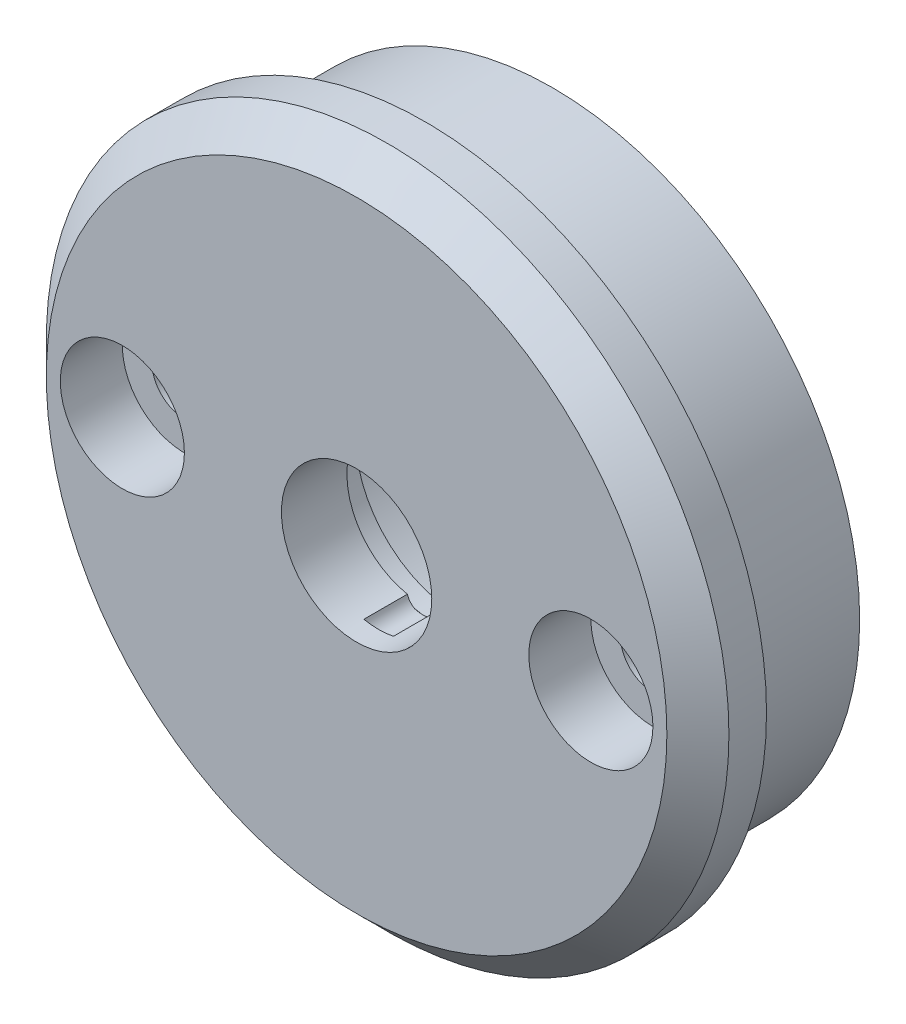
ISO-10303-21;
HEADER;
FILE_DESCRIPTION(('STEP AP214'),'2;1');
FILE_NAME('part.step','',(''),(''),'','','');
FILE_SCHEMA(('AUTOMOTIVE_DESIGN { 1 0 10303 214 1 1 1 1 }'));
ENDSEC;
DATA;
#1=APPLICATION_CONTEXT('core data for automotive mechanical design processes');
#2=APPLICATION_PROTOCOL_DEFINITION('international standard','automotive_design',2000,#1);
#3=PRODUCT_CONTEXT('',#1,'mechanical');
#4=PRODUCT('Part','Part','',(#3));
#5=PRODUCT_RELATED_PRODUCT_CATEGORY('part','',(#4));
#6=PRODUCT_DEFINITION_FORMATION('','',#4);
#7=PRODUCT_DEFINITION_CONTEXT('part definition',#1,'design');
#8=PRODUCT_DEFINITION('design','',#6,#7);
#9=PRODUCT_DEFINITION_SHAPE('','',#8);
#10=(LENGTH_UNIT() NAMED_UNIT(*) SI_UNIT(.MILLI.,.METRE.));
#11=(NAMED_UNIT(*) PLANE_ANGLE_UNIT() SI_UNIT($,.RADIAN.));
#12=(NAMED_UNIT(*) SI_UNIT($,.STERADIAN.) SOLID_ANGLE_UNIT());
#13=UNCERTAINTY_MEASURE_WITH_UNIT(LENGTH_MEASURE(1.E-05),#10,'distance_accuracy_value','');
#14=(GEOMETRIC_REPRESENTATION_CONTEXT(3) GLOBAL_UNCERTAINTY_ASSIGNED_CONTEXT((#13)) GLOBAL_UNIT_ASSIGNED_CONTEXT((#10,
#11,#12)) REPRESENTATION_CONTEXT('',''));
#15=CARTESIAN_POINT('',(0.,0.,0.));
#16=DIRECTION('',(0.,0.,1.));
#17=DIRECTION('',(1.,0.,0.));
#18=AXIS2_PLACEMENT_3D('',#15,#16,#17);
#19=CARTESIAN_POINT('',(0.,0.,8.8138));
#20=DIRECTION('',(0.,0.,1.));
#21=DIRECTION('',(1.,0.,0.));
#22=AXIS2_PLACEMENT_3D('',#19,#20,#21);
#23=CYLINDRICAL_SURFACE('',#22,3.35049604189563);
#24=CARTESIAN_POINT('',(0.,0.,6.11323938480862));
#25=DIRECTION('',(0.,0.,1.));
#26=DIRECTION('',(1.,0.,0.));
#27=AXIS2_PLACEMENT_3D('',#24,#25,#26);
#28=CIRCLE('',#27,3.35049604189563);
#29=CARTESIAN_POINT('',(3.35049604189563,0.,6.11323938480862));
#30=VERTEX_POINT('',#29);
#31=EDGE_CURVE('E109',#30,#30,#28,.T.);
#32=ORIENTED_EDGE('',*,*,#31,.T.);
#33=EDGE_LOOP('',(#32));
#34=FACE_BOUND('',#33,.T.);
#35=CARTESIAN_POINT('',(0.,0.,5.5));
#36=DIRECTION('',(0.,0.,-1.));
#37=DIRECTION('',(-1.,0.,0.));
#38=AXIS2_PLACEMENT_3D('',#35,#36,#37);
#39=CIRCLE('',#38,3.35049604189563);
#40=CARTESIAN_POINT('',(-3.35049604189563,0.,5.5));
#41=VERTEX_POINT('',#40);
#42=EDGE_CURVE('E41',#41,#41,#39,.T.);
#43=ORIENTED_EDGE('',*,*,#42,.T.);
#44=EDGE_LOOP('',(#43));
#45=FACE_BOUND('',#44,.T.);
#46=ADVANCED_FACE('F37',(#34,#45),#23,.F.);
#47=CARTESIAN_POINT('',(0.,0.,6.64456878253333));
#48=DIRECTION('',(0.,0.,-1.));
#49=DIRECTION('',(-1.,0.,0.));
#50=AXIS2_PLACEMENT_3D('',#47,#48,#49);
#51=CONICAL_SURFACE('',#50,2.81439972504782,1.18074682878586);
#52=CARTESIAN_POINT('',(0.,0.,6.64456878253333));
#53=DIRECTION('',(0.,0.,1.));
#54=DIRECTION('',(1.,0.,0.));
#55=AXIS2_PLACEMENT_3D('',#52,#53,#54);
#56=CIRCLE('',#55,2.81439972504782);
#57=CARTESIAN_POINT('',(2.81439972504782,0.,6.64456878253333));
#58=VERTEX_POINT('',#57);
#59=EDGE_CURVE('E99',#58,#58,#56,.T.);
#60=ORIENTED_EDGE('',*,*,#59,.F.);
#61=EDGE_LOOP('',(#60));
#62=FACE_BOUND('',#61,.T.);
#63=CARTESIAN_POINT('',(0.,0.,6.7024));
#64=DIRECTION('',(0.,0.,1.));
#65=DIRECTION('',(1.,0.,0.));
#66=AXIS2_PLACEMENT_3D('',#63,#64,#65);
#67=CIRCLE('',#66,2.67372976637506);
#68=CARTESIAN_POINT('',(0.23601181779238,-2.66329294022698,6.7024));
#69=VERTEX_POINT('',#68);
#70=CARTESIAN_POINT('',(-0.23601184677652,-2.66329293765841,6.7024));
#71=VERTEX_POINT('',#70);
#72=EDGE_CURVE('E102',#69,#71,#67,.T.);
#73=ORIENTED_EDGE('',*,*,#72,.T.);
#74=CARTESIAN_POINT('',(-0.237101570117122,-2.66270773639584,6.7026));
#75=CARTESIAN_POINT('',(-0.213679926869046,-2.67535440156854,6.69827983920556));
#76=CARTESIAN_POINT('',(-0.18912610567362,-2.68613475785027,6.6946184097991));
#77=CARTESIAN_POINT('',(-0.138511756627153,-2.70366864759667,6.68868327670582));
#78=CARTESIAN_POINT('',(-0.11245393789757,-2.71042918794483,6.68640715813914));
#79=CARTESIAN_POINT('',(-0.0594618190843971,-2.71968247440472,6.68329497302182));
#80=CARTESIAN_POINT('',(-0.0325262378943675,-2.72216866910523,6.68246111705631));
#81=CARTESIAN_POINT('',(0.021401514654019,-2.72276944956596,6.68225951857189));
#82=CARTESIAN_POINT('',(0.0483936934876825,-2.72088341605895,6.68289198373762));
#83=CARTESIAN_POINT('',(0.103420724892745,-2.71252704584527,6.685700818439));
#84=CARTESIAN_POINT('',(0.131405640518964,-2.70576034906342,6.68797700828826));
#85=CARTESIAN_POINT('',(0.185731129101988,-2.68761948363871,6.69411466789505));
#86=CARTESIAN_POINT('',(0.212067631497004,-2.6762343913812,6.6979798964044));
#87=CARTESIAN_POINT('',(0.237101541139547,-2.66270773897616,6.7026));
#88=B_SPLINE_CURVE_WITH_KNOTS('',3,(#74,#75,#76,#77,#78,#79,#80,#81,#82,#83,#84,#85,#86,#87),
.UNSPECIFIED.,.F.,.F.,(4,2,2,2,2,2,4),(0.,0.0808113668682006,0.161481456492934,
0.242275081591732,0.32308015071825,0.409255855997593,0.495636587145606),.UNSPECIFIED.);
#89=EDGE_CURVE('E113',#71,#69,#88,.T.);
#90=ORIENTED_EDGE('',*,*,#89,.T.);
#91=EDGE_LOOP('',(#73,#90));
#92=FACE_BOUND('',#91,.T.);
#93=ADVANCED_FACE('F121',(#62,#92),#51,.F.);
#94=CARTESIAN_POINT('',(0.,0.,8.8138));
#95=DIRECTION('',(0.,0.,1.));
#96=DIRECTION('',(1.,0.,0.));
#97=AXIS2_PLACEMENT_3D('',#94,#95,#96);
#98=CYLINDRICAL_SURFACE('',#97,2.4225);
#99=CARTESIAN_POINT('',(0.,0.,8.8138));
#100=DIRECTION('',(0.,0.,1.));
#101=DIRECTION('',(1.,0.,0.));
#102=AXIS2_PLACEMENT_3D('',#99,#100,#101);
#103=CIRCLE('',#102,2.4225);
#104=CARTESIAN_POINT('',(2.4225,0.,8.8138));
#105=VERTEX_POINT('',#104);
#106=EDGE_CURVE('E106',#105,#105,#103,.T.);
#107=ORIENTED_EDGE('',*,*,#106,.T.);
#108=EDGE_LOOP('',(#107));
#109=FACE_BOUND('',#108,.T.);
#110=CARTESIAN_POINT('',(0.,0.,6.7024));
#111=DIRECTION('',(0.,0.,1.));
#112=DIRECTION('',(1.,0.,0.));
#113=AXIS2_PLACEMENT_3D('',#110,#111,#112);
#114=CIRCLE('',#113,2.4225);
#115=CARTESIAN_POINT('',(0.476094130424396,-2.37525590810242,6.7024));
#116=VERTEX_POINT('',#115);
#117=CARTESIAN_POINT('',(-0.476094156273707,-2.3752559029212,6.7024));
#118=VERTEX_POINT('',#117);
#119=EDGE_CURVE('E85',#116,#118,#114,.T.);
#120=ORIENTED_EDGE('',*,*,#119,.F.);
#121=DIRECTION('',(0.,0.,1.));
#122=VECTOR('',#121,1.);
#123=CARTESIAN_POINT('',(0.476094130424397,-2.37525590810242,5.3012));
#124=LINE('',#123,#122);
#125=CARTESIAN_POINT('',(0.476094130424397,-2.37525590810242,8.1024));
#126=VERTEX_POINT('',#125);
#127=EDGE_CURVE('E59',#116,#126,#124,.T.);
#128=ORIENTED_EDGE('',*,*,#127,.T.);
#129=CARTESIAN_POINT('',(0.,0.,8.1024));
#130=DIRECTION('',(0.,0.,-1.));
#131=DIRECTION('',(-1.,0.,0.));
#132=AXIS2_PLACEMENT_3D('',#129,#130,#131);
#133=CIRCLE('',#132,2.4225);
#134=CARTESIAN_POINT('',(-0.476094156273706,-2.3752559029212,8.1024));
#135=VERTEX_POINT('',#134);
#136=EDGE_CURVE('E71',#126,#135,#133,.T.);
#137=ORIENTED_EDGE('',*,*,#136,.T.);
#138=DIRECTION('',(0.,0.,1.));
#139=VECTOR('',#138,1.);
#140=CARTESIAN_POINT('',(-0.476094156273706,-2.3752559029212,5.3012));
#141=LINE('',#140,#139);
#142=EDGE_CURVE('E75',#135,#118,#141,.F.);
#143=ORIENTED_EDGE('',*,*,#142,.T.);
#144=EDGE_LOOP('',(#120,#128,#137,#143));
#145=FACE_BOUND('',#144,.T.);
#146=ADVANCED_FACE('F83',(#109,#145),#98,.F.);
#147=CARTESIAN_POINT('',(0.,0.,2.5));
#148=DIRECTION('',(0.,0.,1.));
#149=DIRECTION('',(1.,0.,0.));
#150=AXIS2_PLACEMENT_3D('',#147,#148,#149);
#151=PLANE('',#150);
#152=CARTESIAN_POINT('',(0.,0.,2.5));
#153=DIRECTION('',(0.,0.,-1.));
#154=DIRECTION('',(-1.,0.,0.));
#155=AXIS2_PLACEMENT_3D('',#152,#153,#154);
#156=CIRCLE('',#155,6.00302811884645);
#157=CARTESIAN_POINT('',(-6.00302811884645,0.,2.5));
#158=VERTEX_POINT('',#157);
#159=EDGE_CURVE('E165',#158,#158,#156,.T.);
#160=ORIENTED_EDGE('',*,*,#159,.F.);
#161=EDGE_LOOP('',(#160));
#162=FACE_BOUND('',#161,.T.);
#163=CARTESIAN_POINT('',(7.55,0.,2.5));
#164=DIRECTION('',(0.,0.,1.));
#165=DIRECTION('',(1.,0.,0.));
#166=AXIS2_PLACEMENT_3D('',#163,#164,#165);
#167=CIRCLE('',#166,1.05);
#168=CARTESIAN_POINT('',(8.6,0.,2.5));
#169=VERTEX_POINT('',#168);
#170=EDGE_CURVE('E162',#169,#169,#167,.T.);
#171=ORIENTED_EDGE('',*,*,#170,.T.);
#172=EDGE_LOOP('',(#171));
#173=FACE_BOUND('',#172,.T.);
#174=CARTESIAN_POINT('',(-7.54951177513323,0.0858601020535576,2.5));
#175=DIRECTION('',(0.,0.,1.));
#176=DIRECTION('',(1.,0.,0.));
#177=AXIS2_PLACEMENT_3D('',#174,#175,#176);
#178=CIRCLE('',#177,1.05);
#179=CARTESIAN_POINT('',(-6.49951177513323,0.0858601020535576,2.5));
#180=VERTEX_POINT('',#179);
#181=EDGE_CURVE('E175',#180,#180,#178,.T.);
#182=ORIENTED_EDGE('',*,*,#181,.T.);
#183=EDGE_LOOP('',(#182));
#184=FACE_BOUND('',#183,.T.);
#185=CARTESIAN_POINT('',(0.,0.,2.5));
#186=DIRECTION('',(0.,0.,1.));
#187=DIRECTION('',(1.,0.,0.));
#188=AXIS2_PLACEMENT_3D('',#185,#186,#187);
#189=CIRCLE('',#188,9.89999999999998);
#190=CARTESIAN_POINT('',(9.89999999999998,0.,2.5));
#191=VERTEX_POINT('',#190);
#192=EDGE_CURVE('E76',#191,#191,#189,.T.);
#193=ORIENTED_EDGE('',*,*,#192,.F.);
#194=EDGE_LOOP('',(#193));
#195=FACE_BOUND('',#194,.T.);
#196=ADVANCED_FACE('F135',(#162,#173,#184,#195),#151,.F.);
#197=CARTESIAN_POINT('',(0.,0.,34.7038285349872));
#198=DIRECTION('',(0.,0.,-1.));
#199=DIRECTION('',(-1.,0.,0.));
#200=AXIS2_PLACEMENT_3D('',#197,#198,#199);
#201=CYLINDRICAL_SURFACE('',#200,9.89999999999998);
#202=CARTESIAN_POINT('',(0.,0.,6.6024));
#203=DIRECTION('',(0.,0.,1.));
#204=DIRECTION('',(1.,0.,0.));
#205=AXIS2_PLACEMENT_3D('',#202,#203,#204);
#206=CIRCLE('',#205,9.89999999999998);
#207=CARTESIAN_POINT('',(9.89999999999998,0.,6.6024));
#208=VERTEX_POINT('',#207);
#209=EDGE_CURVE('E93',#208,#208,#206,.T.);
#210=ORIENTED_EDGE('',*,*,#209,.F.);
#211=EDGE_LOOP('',(#210));
#212=FACE_BOUND('',#211,.T.);
#213=ORIENTED_EDGE('',*,*,#192,.T.);
#214=EDGE_LOOP('',(#213));
#215=FACE_BOUND('',#214,.T.);
#216=ADVANCED_FACE('F216',(#212,#215),#201,.T.);
#217=CARTESIAN_POINT('',(0.,0.,39.9264983722081));
#218=DIRECTION('',(0.,0.,-1.));
#219=DIRECTION('',(-1.,0.,0.));
#220=AXIS2_PLACEMENT_3D('',#217,#218,#219);
#221=CYLINDRICAL_SURFACE('',#220,11.);
#222=CARTESIAN_POINT('',(0.,0.,7.8138));
#223=DIRECTION('',(0.,0.,1.));
#224=DIRECTION('',(1.,0.,0.));
#225=AXIS2_PLACEMENT_3D('',#222,#223,#224);
#226=CIRCLE('',#225,11.);
#227=CARTESIAN_POINT('',(11.,0.,7.8138));
#228=VERTEX_POINT('',#227);
#229=EDGE_CURVE('E11',#228,#228,#226,.F.);
#230=ORIENTED_EDGE('',*,*,#229,.T.);
#231=EDGE_LOOP('',(#230));
#232=FACE_BOUND('',#231,.T.);
#233=CARTESIAN_POINT('',(0.,0.,6.6024));
#234=DIRECTION('',(0.,0.,1.));
#235=DIRECTION('',(1.,0.,0.));
#236=AXIS2_PLACEMENT_3D('',#233,#234,#235);
#237=CIRCLE('',#236,11.);
#238=CARTESIAN_POINT('',(11.,0.,6.6024));
#239=VERTEX_POINT('',#238);
#240=EDGE_CURVE('E96',#239,#239,#237,.T.);
#241=ORIENTED_EDGE('',*,*,#240,.T.);
#242=EDGE_LOOP('',(#241));
#243=FACE_BOUND('',#242,.T.);
#244=ADVANCED_FACE('F213',(#232,#243),#221,.T.);
#245=CARTESIAN_POINT('',(0.,0.,6.6024));
#246=DIRECTION('',(0.,0.,1.));
#247=DIRECTION('',(1.,0.,0.));
#248=AXIS2_PLACEMENT_3D('',#245,#246,#247);
#249=PLANE('',#248);
#250=ORIENTED_EDGE('',*,*,#209,.T.);
#251=EDGE_LOOP('',(#250));
#252=FACE_BOUND('',#251,.T.);
#253=ORIENTED_EDGE('',*,*,#240,.F.);
#254=EDGE_LOOP('',(#253));
#255=FACE_BOUND('',#254,.T.);
#256=ADVANCED_FACE('F196',(#252,#255),#249,.F.);
#257=CARTESIAN_POINT('',(2.2225,0.70954173894978,8.8138));
#258=DIRECTION('',(0.,0.,1.));
#259=DIRECTION('',(1.,0.,0.));
#260=AXIS2_PLACEMENT_3D('',#257,#258,#259);
#261=PLANE('',#260);
#262=CARTESIAN_POINT('',(7.55,0.,8.8138));
#263=DIRECTION('',(0.,0.,1.));
#264=DIRECTION('',(1.,0.,0.));
#265=AXIS2_PLACEMENT_3D('',#262,#263,#264);
#266=CIRCLE('',#265,2.);
#267=CARTESIAN_POINT('',(9.55,0.,8.8138));
#268=VERTEX_POINT('',#267);
#269=EDGE_CURVE('E178',#268,#268,#266,.T.);
#270=ORIENTED_EDGE('',*,*,#269,.F.);
#271=EDGE_LOOP('',(#270));
#272=FACE_BOUND('',#271,.T.);
#273=CARTESIAN_POINT('',(-7.54951177513323,0.0858601020535576,8.8138));
#274=DIRECTION('',(0.,0.,1.));
#275=DIRECTION('',(1.,0.,0.));
#276=AXIS2_PLACEMENT_3D('',#273,#274,#275);
#277=CIRCLE('',#276,2.);
#278=CARTESIAN_POINT('',(-5.54951177513323,0.0858601020535576,8.8138));
#279=VERTEX_POINT('',#278);
#280=EDGE_CURVE('E184',#279,#279,#277,.T.);
#281=ORIENTED_EDGE('',*,*,#280,.F.);
#282=EDGE_LOOP('',(#281));
#283=FACE_BOUND('',#282,.T.);
#284=CARTESIAN_POINT('',(0.,0.,8.8138));
#285=DIRECTION('',(0.,0.,1.));
#286=DIRECTION('',(1.,0.,0.));
#287=AXIS2_PLACEMENT_3D('',#284,#285,#286);
#288=CIRCLE('',#287,10.);
#289=CARTESIAN_POINT('',(10.,0.,8.8138));
#290=VERTEX_POINT('',#289);
#291=EDGE_CURVE('E46',#290,#290,#288,.T.);
#292=ORIENTED_EDGE('',*,*,#291,.T.);
#293=EDGE_LOOP('',(#292));
#294=FACE_BOUND('',#293,.T.);
#295=ORIENTED_EDGE('',*,*,#106,.F.);
#296=EDGE_LOOP('',(#295));
#297=FACE_BOUND('',#296,.T.);
#298=ADVANCED_FACE('F143',(#272,#283,#294,#297),#261,.T.);
#299=CARTESIAN_POINT('',(0.,0.,-315.257599526715));
#300=DIRECTION('',(0.,0.,1.));
#301=DIRECTION('',(1.,0.,0.));
#302=AXIS2_PLACEMENT_3D('',#299,#300,#301);
#303=DEGENERATE_TOROIDAL_SURFACE('',#302,315.694093530672,452.845079732821,.F.);
#304=ORIENTED_EDGE('',*,*,#59,.T.);
#305=EDGE_LOOP('',(#304));
#306=FACE_BOUND('',#305,.T.);
#307=ORIENTED_EDGE('',*,*,#31,.F.);
#308=EDGE_LOOP('',(#307));
#309=FACE_BOUND('',#308,.T.);
#310=ADVANCED_FACE('F138',(#306,#309),#303,.T.);
#311=CARTESIAN_POINT('',(0.,2.67372976637506,6.7024));
#312=DIRECTION('',(0.,0.,-1.));
#313=DIRECTION('',(-1.,0.,0.));
#314=AXIS2_PLACEMENT_3D('',#311,#312,#313);
#315=PLANE('',#314);
#316=ORIENTED_EDGE('',*,*,#119,.T.);
#317=CARTESIAN_POINT('',(-1.20934529041805E-08,-2.2225,6.7024));
#318=DIRECTION('',(0.,0.,-1.));
#319=DIRECTION('',(-1.,0.,0.));
#320=AXIS2_PLACEMENT_3D('',#317,#318,#319);
#321=CIRCLE('',#320,0.5);
#322=EDGE_CURVE('E79',#118,#71,#321,.F.);
#323=ORIENTED_EDGE('',*,*,#322,.T.);
#324=ORIENTED_EDGE('',*,*,#72,.F.);
#325=EDGE_CURVE('E112',#69,#116,#321,.F.);
#326=ORIENTED_EDGE('',*,*,#325,.T.);
#327=EDGE_LOOP('',(#316,#323,#324,#326));
#328=FACE_BOUND('',#327,.T.);
#329=ADVANCED_FACE('F129',(#328),#315,.T.);
#330=CARTESIAN_POINT('',(-1.20934529041805E-08,-2.2225,2.5));
#331=DIRECTION('',(0.,0.,1.));
#332=DIRECTION('',(1.,0.,0.));
#333=AXIS2_PLACEMENT_3D('',#330,#331,#332);
#334=CYLINDRICAL_SURFACE('',#333,0.5);
#335=ORIENTED_EDGE('',*,*,#325,.F.);
#336=ORIENTED_EDGE('',*,*,#89,.F.);
#337=ORIENTED_EDGE('',*,*,#322,.F.);
#338=ORIENTED_EDGE('',*,*,#142,.F.);
#339=CARTESIAN_POINT('',(-1.20934529041805E-08,-2.2225,8.1024));
#340=DIRECTION('',(0.,0.,-1.));
#341=DIRECTION('',(-1.,0.,0.));
#342=AXIS2_PLACEMENT_3D('',#339,#340,#341);
#343=CIRCLE('',#342,0.5);
#344=EDGE_CURVE('E52',#126,#135,#343,.T.);
#345=ORIENTED_EDGE('',*,*,#344,.F.);
#346=ORIENTED_EDGE('',*,*,#127,.F.);
#347=EDGE_LOOP('',(#335,#336,#337,#338,#345,#346));
#348=FACE_BOUND('',#347,.T.);
#349=ADVANCED_FACE('F78',(#348),#334,.F.);
#350=CARTESIAN_POINT('',(-1.20934529041805E-08,-2.2225,8.1024));
#351=DIRECTION('',(0.,0.,-1.));
#352=DIRECTION('',(-1.,0.,0.));
#353=AXIS2_PLACEMENT_3D('',#350,#351,#352);
#354=PLANE('',#353);
#355=ORIENTED_EDGE('',*,*,#344,.T.);
#356=ORIENTED_EDGE('',*,*,#136,.F.);
#357=EDGE_LOOP('',(#355,#356));
#358=FACE_BOUND('',#357,.T.);
#359=ADVANCED_FACE('F72',(#358),#354,.T.);
#360=CARTESIAN_POINT('',(0.,0.,8.8138));
#361=DIRECTION('',(0.,0.,-1.));
#362=DIRECTION('',(-1.,0.,0.));
#363=AXIS2_PLACEMENT_3D('',#360,#361,#362);
#364=CONICAL_SURFACE('',#363,10.,0.785398163397447);
#365=ORIENTED_EDGE('',*,*,#229,.F.);
#366=EDGE_LOOP('',(#365));
#367=FACE_BOUND('',#366,.T.);
#368=ORIENTED_EDGE('',*,*,#291,.F.);
#369=EDGE_LOOP('',(#368));
#370=FACE_BOUND('',#369,.T.);
#371=ADVANCED_FACE('F39',(#367,#370),#364,.T.);
#372=CARTESIAN_POINT('',(-7.54951177513323,0.0858601020535576,6.8138));
#373=DIRECTION('',(0.,0.,1.));
#374=DIRECTION('',(1.,0.,0.));
#375=AXIS2_PLACEMENT_3D('',#372,#373,#374);
#376=CYLINDRICAL_SURFACE('',#375,2.);
#377=CARTESIAN_POINT('',(-7.54951177513323,0.0858601020535576,6.8138));
#378=DIRECTION('',(0.,0.,1.));
#379=DIRECTION('',(1.,0.,0.));
#380=AXIS2_PLACEMENT_3D('',#377,#378,#379);
#381=CIRCLE('',#380,2.);
#382=CARTESIAN_POINT('',(-5.54951177513323,0.0858601020535576,6.8138));
#383=VERTEX_POINT('',#382);
#384=EDGE_CURVE('E80',#383,#383,#381,.T.);
#385=ORIENTED_EDGE('',*,*,#384,.F.);
#386=EDGE_LOOP('',(#385));
#387=FACE_BOUND('',#386,.T.);
#388=ORIENTED_EDGE('',*,*,#280,.T.);
#389=EDGE_LOOP('',(#388));
#390=FACE_BOUND('',#389,.T.);
#391=ADVANCED_FACE('F192',(#387,#390),#376,.F.);
#392=CARTESIAN_POINT('',(-7.54951177513323,0.0858601020535576,6.8138));
#393=DIRECTION('',(0.,0.,1.));
#394=DIRECTION('',(1.,0.,0.));
#395=AXIS2_PLACEMENT_3D('',#392,#393,#394);
#396=PLANE('',#395);
#397=CARTESIAN_POINT('',(-7.54951177513323,0.0858601020535576,6.8138));
#398=DIRECTION('',(0.,0.,1.));
#399=DIRECTION('',(1.,0.,0.));
#400=AXIS2_PLACEMENT_3D('',#397,#398,#399);
#401=CIRCLE('',#400,1.05);
#402=CARTESIAN_POINT('',(-6.49951177513323,0.0858601020535576,6.8138));
#403=VERTEX_POINT('',#402);
#404=EDGE_CURVE('E173',#403,#403,#401,.T.);
#405=ORIENTED_EDGE('',*,*,#404,.F.);
#406=EDGE_LOOP('',(#405));
#407=FACE_BOUND('',#406,.T.);
#408=ORIENTED_EDGE('',*,*,#384,.T.);
#409=EDGE_LOOP('',(#408));
#410=FACE_BOUND('',#409,.T.);
#411=ADVANCED_FACE('F209',(#407,#410),#396,.T.);
#412=CARTESIAN_POINT('',(7.55,0.,6.8138));
#413=DIRECTION('',(0.,0.,1.));
#414=DIRECTION('',(1.,0.,0.));
#415=AXIS2_PLACEMENT_3D('',#412,#413,#414);
#416=CYLINDRICAL_SURFACE('',#415,2.);
#417=CARTESIAN_POINT('',(7.55,0.,6.8138));
#418=DIRECTION('',(0.,0.,1.));
#419=DIRECTION('',(1.,0.,0.));
#420=AXIS2_PLACEMENT_3D('',#417,#418,#419);
#421=CIRCLE('',#420,2.);
#422=CARTESIAN_POINT('',(9.55,0.,6.8138));
#423=VERTEX_POINT('',#422);
#424=EDGE_CURVE('E181',#423,#423,#421,.T.);
#425=ORIENTED_EDGE('',*,*,#424,.F.);
#426=EDGE_LOOP('',(#425));
#427=FACE_BOUND('',#426,.T.);
#428=ORIENTED_EDGE('',*,*,#269,.T.);
#429=EDGE_LOOP('',(#428));
#430=FACE_BOUND('',#429,.T.);
#431=ADVANCED_FACE('F271',(#427,#430),#416,.F.);
#432=CARTESIAN_POINT('',(7.55,0.,6.8138));
#433=DIRECTION('',(0.,0.,1.));
#434=DIRECTION('',(1.,0.,0.));
#435=AXIS2_PLACEMENT_3D('',#432,#433,#434);
#436=PLANE('',#435);
#437=CARTESIAN_POINT('',(7.55,0.,6.8138));
#438=DIRECTION('',(0.,0.,1.));
#439=DIRECTION('',(1.,0.,0.));
#440=AXIS2_PLACEMENT_3D('',#437,#438,#439);
#441=CIRCLE('',#440,1.05);
#442=CARTESIAN_POINT('',(8.6,0.,6.8138));
#443=VERTEX_POINT('',#442);
#444=EDGE_CURVE('E159',#443,#443,#441,.T.);
#445=ORIENTED_EDGE('',*,*,#444,.F.);
#446=EDGE_LOOP('',(#445));
#447=FACE_BOUND('',#446,.T.);
#448=ORIENTED_EDGE('',*,*,#424,.T.);
#449=EDGE_LOOP('',(#448));
#450=FACE_BOUND('',#449,.T.);
#451=ADVANCED_FACE('F276',(#447,#450),#436,.T.);
#452=CARTESIAN_POINT('',(-7.54951177513323,0.0858601020535576,2.5));
#453=DIRECTION('',(0.,0.,1.));
#454=DIRECTION('',(1.,0.,0.));
#455=AXIS2_PLACEMENT_3D('',#452,#453,#454);
#456=CYLINDRICAL_SURFACE('',#455,1.05);
#457=ORIENTED_EDGE('',*,*,#181,.F.);
#458=EDGE_LOOP('',(#457));
#459=FACE_BOUND('',#458,.T.);
#460=ORIENTED_EDGE('',*,*,#404,.T.);
#461=EDGE_LOOP('',(#460));
#462=FACE_BOUND('',#461,.T.);
#463=ADVANCED_FACE('F293',(#459,#462),#456,.F.);
#464=CARTESIAN_POINT('',(7.55,0.,2.5));
#465=DIRECTION('',(0.,0.,1.));
#466=DIRECTION('',(1.,0.,0.));
#467=AXIS2_PLACEMENT_3D('',#464,#465,#466);
#468=CYLINDRICAL_SURFACE('',#467,1.05);
#469=ORIENTED_EDGE('',*,*,#170,.F.);
#470=EDGE_LOOP('',(#469));
#471=FACE_BOUND('',#470,.T.);
#472=ORIENTED_EDGE('',*,*,#444,.T.);
#473=EDGE_LOOP('',(#472));
#474=FACE_BOUND('',#473,.T.);
#475=ADVANCED_FACE('F303',(#471,#474),#468,.F.);
#476=CARTESIAN_POINT('',(0.,0.,5.5));
#477=DIRECTION('',(0.,0.,-1.));
#478=DIRECTION('',(-1.,0.,0.));
#479=AXIS2_PLACEMENT_3D('',#476,#477,#478);
#480=CYLINDRICAL_SURFACE('',#479,6.00302811884645);
#481=CARTESIAN_POINT('',(0.,0.,5.5));
#482=DIRECTION('',(0.,0.,-1.));
#483=DIRECTION('',(-1.,0.,0.));
#484=AXIS2_PLACEMENT_3D('',#481,#482,#483);
#485=CIRCLE('',#484,6.00302811884645);
#486=CARTESIAN_POINT('',(-6.00302811884645,0.,5.5));
#487=VERTEX_POINT('',#486);
#488=EDGE_CURVE('E160',#487,#487,#485,.T.);
#489=ORIENTED_EDGE('',*,*,#488,.F.);
#490=EDGE_LOOP('',(#489));
#491=FACE_BOUND('',#490,.T.);
#492=ORIENTED_EDGE('',*,*,#159,.T.);
#493=EDGE_LOOP('',(#492));
#494=FACE_BOUND('',#493,.T.);
#495=ADVANCED_FACE('F313',(#491,#494),#480,.F.);
#496=CARTESIAN_POINT('',(0.,0.,5.5));
#497=DIRECTION('',(0.,0.,-1.));
#498=DIRECTION('',(-1.,0.,0.));
#499=AXIS2_PLACEMENT_3D('',#496,#497,#498);
#500=PLANE('',#499);
#501=ORIENTED_EDGE('',*,*,#42,.F.);
#502=EDGE_LOOP('',(#501));
#503=FACE_BOUND('',#502,.T.);
#504=ORIENTED_EDGE('',*,*,#488,.T.);
#505=EDGE_LOOP('',(#504));
#506=FACE_BOUND('',#505,.T.);
#507=ADVANCED_FACE('F333',(#503,#506),#500,.T.);
#508=CLOSED_SHELL('',(#46,#93,#146,#196,#216,#244,#256,#298,#310,#329,#349,#359,#371,#391,#411,
#431,#451,#463,#475,#495,#507));
#509=MANIFOLD_SOLID_BREP('B2',#508);
#510=ADVANCED_BREP_SHAPE_REPRESENTATION('',(#18,#509),#14);
#511=SHAPE_DEFINITION_REPRESENTATION(#9,#510);
ENDSEC;
END-ISO-10303-21;
